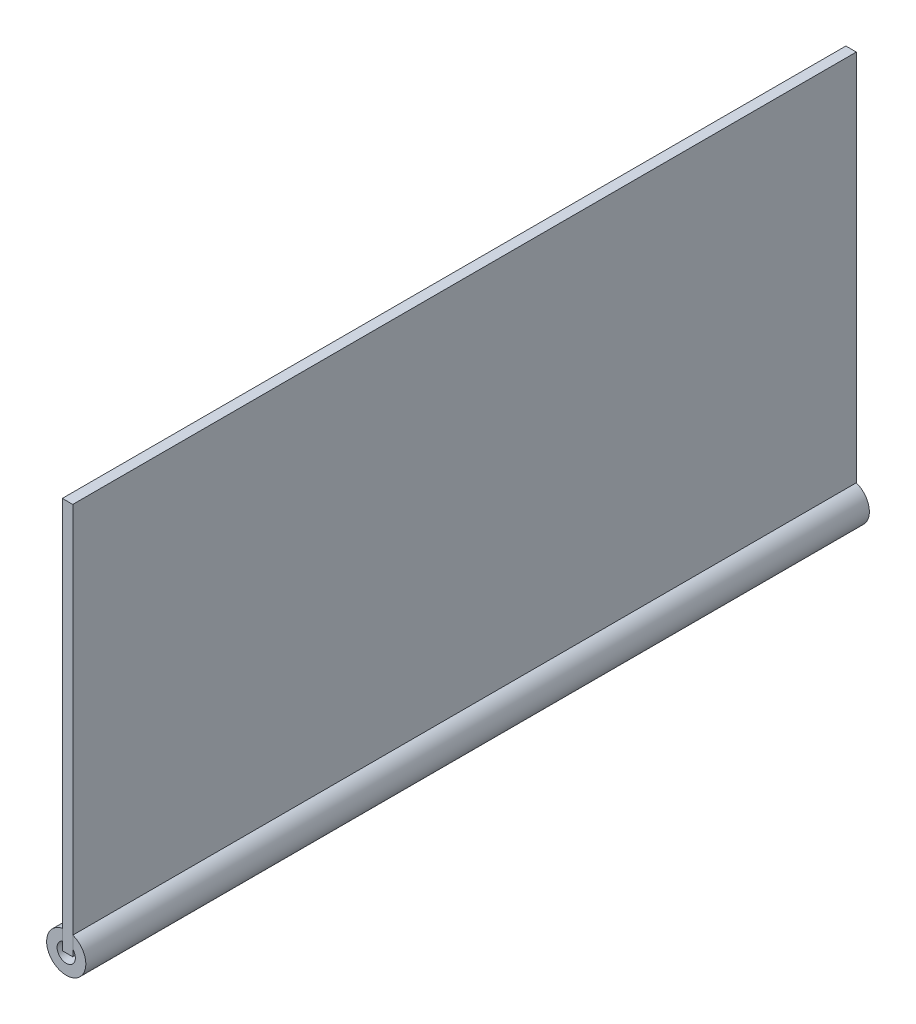
ISO-10303-21;
HEADER;
FILE_DESCRIPTION(('STEP AP214'),'2;1');
FILE_NAME('part.step','',(''),(''),'','','');
FILE_SCHEMA(('AUTOMOTIVE_DESIGN { 1 0 10303 214 1 1 1 1 }'));
ENDSEC;
DATA;
#1=APPLICATION_CONTEXT('core data for automotive mechanical design processes');
#2=APPLICATION_PROTOCOL_DEFINITION('international standard','automotive_design',2000,#1);
#3=PRODUCT_CONTEXT('',#1,'mechanical');
#4=PRODUCT('Part','Part','',(#3));
#5=PRODUCT_RELATED_PRODUCT_CATEGORY('part','',(#4));
#6=PRODUCT_DEFINITION_FORMATION('','',#4);
#7=PRODUCT_DEFINITION_CONTEXT('part definition',#1,'design');
#8=PRODUCT_DEFINITION('design','',#6,#7);
#9=PRODUCT_DEFINITION_SHAPE('','',#8);
#10=(LENGTH_UNIT() NAMED_UNIT(*) SI_UNIT(.MILLI.,.METRE.));
#11=(NAMED_UNIT(*) PLANE_ANGLE_UNIT() SI_UNIT($,.RADIAN.));
#12=(NAMED_UNIT(*) SI_UNIT($,.STERADIAN.) SOLID_ANGLE_UNIT());
#13=UNCERTAINTY_MEASURE_WITH_UNIT(LENGTH_MEASURE(1.E-05),#10,'distance_accuracy_value','');
#14=(GEOMETRIC_REPRESENTATION_CONTEXT(3) GLOBAL_UNCERTAINTY_ASSIGNED_CONTEXT((#13)) GLOBAL_UNIT_ASSIGNED_CONTEXT((#10,
#11,#12)) REPRESENTATION_CONTEXT('',''));
#15=CARTESIAN_POINT('',(0.,0.,0.));
#16=DIRECTION('',(0.,0.,1.));
#17=DIRECTION('',(1.,0.,0.));
#18=AXIS2_PLACEMENT_3D('',#15,#16,#17);
#19=CARTESIAN_POINT('',(4.,75.,-150.));
#20=DIRECTION('',(0.,0.,1.));
#21=DIRECTION('',(1.,0.,0.));
#22=AXIS2_PLACEMENT_3D('',#19,#20,#21);
#23=PLANE('',#22);
#24=DIRECTION('',(0.,1.,0.));
#25=VECTOR('',#24,1.);
#26=CARTESIAN_POINT('',(0.,75.,-150.));
#27=LINE('',#26,#25);
#28=CARTESIAN_POINT('',(0.,-75.,-150.));
#29=VERTEX_POINT('',#28);
#30=CARTESIAN_POINT('',(0.,75.,-150.));
#31=VERTEX_POINT('',#30);
#32=EDGE_CURVE('E110',#29,#31,#27,.T.);
#33=ORIENTED_EDGE('',*,*,#32,.T.);
#34=DIRECTION('',(-1.,0.,0.));
#35=VECTOR('',#34,1.);
#36=CARTESIAN_POINT('',(4.,75.,-150.));
#37=LINE('',#36,#35);
#38=CARTESIAN_POINT('',(4.,75.,-150.));
#39=VERTEX_POINT('',#38);
#40=EDGE_CURVE('E12',#39,#31,#37,.T.);
#41=ORIENTED_EDGE('',*,*,#40,.F.);
#42=DIRECTION('',(0.,1.,0.));
#43=VECTOR('',#42,1.);
#44=CARTESIAN_POINT('',(4.,75.,-150.));
#45=LINE('',#44,#43);
#46=CARTESIAN_POINT('',(4.,-75.,-150.));
#47=VERTEX_POINT('',#46);
#48=EDGE_CURVE('E98',#47,#39,#45,.T.);
#49=ORIENTED_EDGE('',*,*,#48,.F.);
#50=DIRECTION('',(-1.,0.,0.));
#51=VECTOR('',#50,1.);
#52=CARTESIAN_POINT('',(4.,-75.,-150.));
#53=LINE('',#52,#51);
#54=EDGE_CURVE('E106',#47,#29,#53,.T.);
#55=ORIENTED_EDGE('',*,*,#54,.T.);
#56=EDGE_LOOP('',(#33,#41,#49,#55));
#57=FACE_BOUND('',#56,.T.);
#58=ADVANCED_FACE('F47',(#57),#23,.F.);
#59=CARTESIAN_POINT('',(4.,75.,150.));
#60=DIRECTION('',(0.,-1.,0.));
#61=DIRECTION('',(0.,0.,-1.));
#62=AXIS2_PLACEMENT_3D('',#59,#60,#61);
#63=PLANE('',#62);
#64=DIRECTION('',(0.,0.,1.));
#65=VECTOR('',#64,1.);
#66=CARTESIAN_POINT('',(0.,75.,150.));
#67=LINE('',#66,#65);
#68=CARTESIAN_POINT('',(0.,75.,150.));
#69=VERTEX_POINT('',#68);
#70=EDGE_CURVE('E102',#31,#69,#67,.T.);
#71=ORIENTED_EDGE('',*,*,#70,.T.);
#72=DIRECTION('',(-1.,0.,0.));
#73=VECTOR('',#72,1.);
#74=CARTESIAN_POINT('',(4.,75.,150.));
#75=LINE('',#74,#73);
#76=CARTESIAN_POINT('',(4.,75.,150.));
#77=VERTEX_POINT('',#76);
#78=EDGE_CURVE('E55',#77,#69,#75,.T.);
#79=ORIENTED_EDGE('',*,*,#78,.F.);
#80=DIRECTION('',(0.,0.,1.));
#81=VECTOR('',#80,1.);
#82=CARTESIAN_POINT('',(4.,75.,150.));
#83=LINE('',#82,#81);
#84=EDGE_CURVE('E93',#39,#77,#83,.T.);
#85=ORIENTED_EDGE('',*,*,#84,.F.);
#86=ORIENTED_EDGE('',*,*,#40,.T.);
#87=EDGE_LOOP('',(#71,#79,#85,#86));
#88=FACE_BOUND('',#87,.T.);
#89=ADVANCED_FACE('F101',(#88),#63,.F.);
#90=CARTESIAN_POINT('',(4.,75.,150.));
#91=DIRECTION('',(0.,0.,-1.));
#92=DIRECTION('',(0.,1.,0.));
#93=AXIS2_PLACEMENT_3D('',#90,#91,#92);
#94=PLANE('',#93);
#95=DIRECTION('',(0.,-1.,0.));
#96=VECTOR('',#95,1.);
#97=CARTESIAN_POINT('',(0.,75.,150.));
#98=LINE('',#97,#96);
#99=CARTESIAN_POINT('',(0.,-75.,150.));
#100=VERTEX_POINT('',#99);
#101=EDGE_CURVE('E80',#69,#100,#98,.T.);
#102=ORIENTED_EDGE('',*,*,#101,.T.);
#103=DIRECTION('',(-1.,0.,0.));
#104=VECTOR('',#103,1.);
#105=CARTESIAN_POINT('',(4.,-75.,150.));
#106=LINE('',#105,#104);
#107=CARTESIAN_POINT('',(4.,-75.,150.));
#108=VERTEX_POINT('',#107);
#109=EDGE_CURVE('E103',#108,#100,#106,.T.);
#110=ORIENTED_EDGE('',*,*,#109,.F.);
#111=DIRECTION('',(0.,-1.,0.));
#112=VECTOR('',#111,1.);
#113=CARTESIAN_POINT('',(4.,75.,150.));
#114=LINE('',#113,#112);
#115=EDGE_CURVE('E96',#77,#108,#114,.T.);
#116=ORIENTED_EDGE('',*,*,#115,.F.);
#117=ORIENTED_EDGE('',*,*,#78,.T.);
#118=EDGE_LOOP('',(#102,#110,#116,#117));
#119=FACE_BOUND('',#118,.T.);
#120=ADVANCED_FACE('F104',(#119),#94,.F.);
#121=CARTESIAN_POINT('',(4.,-75.,150.));
#122=DIRECTION('',(0.,1.,0.));
#123=DIRECTION('',(0.,0.,1.));
#124=AXIS2_PLACEMENT_3D('',#121,#122,#123);
#125=PLANE('',#124);
#126=DIRECTION('',(0.,0.,-1.));
#127=VECTOR('',#126,1.);
#128=CARTESIAN_POINT('',(0.,-75.,150.));
#129=LINE('',#128,#127);
#130=EDGE_CURVE('E86',#100,#29,#129,.T.);
#131=ORIENTED_EDGE('',*,*,#130,.T.);
#132=ORIENTED_EDGE('',*,*,#54,.F.);
#133=DIRECTION('',(0.,0.,-1.));
#134=VECTOR('',#133,1.);
#135=CARTESIAN_POINT('',(4.,-75.,150.));
#136=LINE('',#135,#134);
#137=EDGE_CURVE('E63',#108,#47,#136,.T.);
#138=ORIENTED_EDGE('',*,*,#137,.F.);
#139=ORIENTED_EDGE('',*,*,#109,.T.);
#140=EDGE_LOOP('',(#131,#132,#138,#139));
#141=FACE_BOUND('',#140,.T.);
#142=ADVANCED_FACE('F117',(#141),#125,.F.);
#143=CARTESIAN_POINT('',(4.,0.,0.));
#144=DIRECTION('',(1.,0.,0.));
#145=DIRECTION('',(0.,0.,-1.));
#146=AXIS2_PLACEMENT_3D('',#143,#144,#145);
#147=PLANE('',#146);
#148=ORIENTED_EDGE('',*,*,#48,.T.);
#149=ORIENTED_EDGE('',*,*,#84,.T.);
#150=ORIENTED_EDGE('',*,*,#115,.T.);
#151=ORIENTED_EDGE('',*,*,#137,.T.);
#152=EDGE_LOOP('',(#148,#149,#150,#151));
#153=FACE_BOUND('',#152,.T.);
#154=ADVANCED_FACE('F94',(#153),#147,.T.);
#155=CARTESIAN_POINT('',(0.,0.,0.));
#156=DIRECTION('',(1.,0.,0.));
#157=DIRECTION('',(0.,0.,-1.));
#158=AXIS2_PLACEMENT_3D('',#155,#156,#157);
#159=PLANE('',#158);
#160=ORIENTED_EDGE('',*,*,#32,.F.);
#161=ORIENTED_EDGE('',*,*,#130,.F.);
#162=ORIENTED_EDGE('',*,*,#101,.F.);
#163=ORIENTED_EDGE('',*,*,#70,.F.);
#164=EDGE_LOOP('',(#160,#161,#162,#163));
#165=FACE_BOUND('',#164,.T.);
#166=ADVANCED_FACE('F120',(#165),#159,.F.);
#167=CLOSED_SHELL('',(#58,#89,#120,#142,#154,#166));
#168=MANIFOLD_SOLID_BREP('B2',#167);
#169=CARTESIAN_POINT('',(3.,-74.9,-150.));
#170=DIRECTION('',(0.,0.,1.));
#171=DIRECTION('',(1.,0.,0.));
#172=AXIS2_PLACEMENT_3D('',#169,#170,#171);
#173=PLANE('',#172);
#174=CARTESIAN_POINT('',(1.5,-74.9,-150.));
#175=DIRECTION('',(0.,0.,1.));
#176=DIRECTION('',(1.,0.,0.));
#177=AXIS2_PLACEMENT_3D('',#174,#175,#176);
#178=CIRCLE('',#177,3.5);
#179=CARTESIAN_POINT('',(5.,-74.9,-150.));
#180=VERTEX_POINT('',#179);
#181=EDGE_CURVE('E228',#180,#180,#178,.T.);
#182=ORIENTED_EDGE('',*,*,#181,.T.);
#183=EDGE_LOOP('',(#182));
#184=FACE_BOUND('',#183,.T.);
#185=DIRECTION('',(0.,1.,0.));
#186=VECTOR('',#185,1.);
#187=CARTESIAN_POINT('',(3.,-74.9,-150.));
#188=LINE('',#187,#186);
#189=CARTESIAN_POINT('',(3.,-67.5515307716505,-150.));
#190=VERTEX_POINT('',#189);
#191=CARTESIAN_POINT('',(3.,74.9,-150.));
#192=VERTEX_POINT('',#191);
#193=EDGE_CURVE('E234',#190,#192,#188,.T.);
#194=ORIENTED_EDGE('',*,*,#193,.F.);
#195=CARTESIAN_POINT('',(1.5,-74.9,-150.));
#196=DIRECTION('',(0.,0.,1.));
#197=DIRECTION('',(1.,0.,0.));
#198=AXIS2_PLACEMENT_3D('',#195,#196,#197);
#199=CIRCLE('',#198,7.5);
#200=CARTESIAN_POINT('',(0.,-67.5515307716505,-150.));
#201=VERTEX_POINT('',#200);
#202=EDGE_CURVE('E217',#201,#190,#199,.T.);
#203=ORIENTED_EDGE('',*,*,#202,.F.);
#204=DIRECTION('',(0.,1.,0.));
#205=VECTOR('',#204,1.);
#206=CARTESIAN_POINT('',(0.,-74.9,-150.));
#207=LINE('',#206,#205);
#208=CARTESIAN_POINT('',(0.,74.9,-150.));
#209=VERTEX_POINT('',#208);
#210=EDGE_CURVE('E198',#201,#209,#207,.T.);
#211=ORIENTED_EDGE('',*,*,#210,.T.);
#212=DIRECTION('',(-1.,0.,0.));
#213=VECTOR('',#212,1.);
#214=CARTESIAN_POINT('',(3.,74.9,-150.));
#215=LINE('',#214,#213);
#216=EDGE_CURVE('E179',#192,#209,#215,.T.);
#217=ORIENTED_EDGE('',*,*,#216,.F.);
#218=EDGE_LOOP('',(#194,#203,#211,#217));
#219=FACE_BOUND('',#218,.T.);
#220=ADVANCED_FACE('F171',(#184,#219),#173,.F.);
#221=CARTESIAN_POINT('',(3.,74.9,150.));
#222=DIRECTION('',(0.,-1.,0.));
#223=DIRECTION('',(0.,0.,-1.));
#224=AXIS2_PLACEMENT_3D('',#221,#222,#223);
#225=PLANE('',#224);
#226=DIRECTION('',(0.,0.,1.));
#227=VECTOR('',#226,1.);
#228=CARTESIAN_POINT('',(0.,74.9,150.));
#229=LINE('',#228,#227);
#230=CARTESIAN_POINT('',(0.,74.9,150.));
#231=VERTEX_POINT('',#230);
#232=EDGE_CURVE('E239',#209,#231,#229,.T.);
#233=ORIENTED_EDGE('',*,*,#232,.T.);
#234=DIRECTION('',(-1.,0.,0.));
#235=VECTOR('',#234,1.);
#236=CARTESIAN_POINT('',(3.,74.9,150.));
#237=LINE('',#236,#235);
#238=CARTESIAN_POINT('',(3.,74.9,150.));
#239=VERTEX_POINT('',#238);
#240=EDGE_CURVE('E231',#239,#231,#237,.T.);
#241=ORIENTED_EDGE('',*,*,#240,.F.);
#242=DIRECTION('',(0.,0.,1.));
#243=VECTOR('',#242,1.);
#244=CARTESIAN_POINT('',(3.,74.9,150.));
#245=LINE('',#244,#243);
#246=EDGE_CURVE('E187',#192,#239,#245,.T.);
#247=ORIENTED_EDGE('',*,*,#246,.F.);
#248=ORIENTED_EDGE('',*,*,#216,.T.);
#249=EDGE_LOOP('',(#233,#241,#247,#248));
#250=FACE_BOUND('',#249,.T.);
#251=ADVANCED_FACE('F243',(#250),#225,.F.);
#252=CARTESIAN_POINT('',(3.,-74.9,150.));
#253=DIRECTION('',(0.,0.,-1.));
#254=DIRECTION('',(-1.,0.,0.));
#255=AXIS2_PLACEMENT_3D('',#252,#253,#254);
#256=PLANE('',#255);
#257=CARTESIAN_POINT('',(1.5,-74.9,150.));
#258=DIRECTION('',(0.,0.,1.));
#259=DIRECTION('',(1.,0.,0.));
#260=AXIS2_PLACEMENT_3D('',#257,#258,#259);
#261=CIRCLE('',#260,3.5);
#262=CARTESIAN_POINT('',(5.,-74.9,150.));
#263=VERTEX_POINT('',#262);
#264=EDGE_CURVE('E246',#263,#263,#261,.T.);
#265=ORIENTED_EDGE('',*,*,#264,.F.);
#266=EDGE_LOOP('',(#265));
#267=FACE_BOUND('',#266,.T.);
#268=DIRECTION('',(0.,-1.,0.));
#269=VECTOR('',#268,1.);
#270=CARTESIAN_POINT('',(0.,-74.9,150.));
#271=LINE('',#270,#269);
#272=CARTESIAN_POINT('',(0.,-67.5515307716505,150.));
#273=VERTEX_POINT('',#272);
#274=EDGE_CURVE('E227',#231,#273,#271,.T.);
#275=ORIENTED_EDGE('',*,*,#274,.T.);
#276=CARTESIAN_POINT('',(1.5,-74.9,150.));
#277=DIRECTION('',(0.,0.,1.));
#278=DIRECTION('',(1.,0.,0.));
#279=AXIS2_PLACEMENT_3D('',#276,#277,#278);
#280=CIRCLE('',#279,7.5);
#281=CARTESIAN_POINT('',(3.,-67.5515307716505,150.));
#282=VERTEX_POINT('',#281);
#283=EDGE_CURVE('E216',#273,#282,#280,.T.);
#284=ORIENTED_EDGE('',*,*,#283,.T.);
#285=DIRECTION('',(0.,-1.,0.));
#286=VECTOR('',#285,1.);
#287=CARTESIAN_POINT('',(3.,-74.9,150.));
#288=LINE('',#287,#286);
#289=EDGE_CURVE('E225',#239,#282,#288,.T.);
#290=ORIENTED_EDGE('',*,*,#289,.F.);
#291=ORIENTED_EDGE('',*,*,#240,.T.);
#292=EDGE_LOOP('',(#275,#284,#290,#291));
#293=FACE_BOUND('',#292,.T.);
#294=ADVANCED_FACE('F223',(#267,#293),#256,.F.);
#295=CARTESIAN_POINT('',(3.,0.,0.));
#296=DIRECTION('',(-1.,0.,0.));
#297=DIRECTION('',(0.,0.,1.));
#298=AXIS2_PLACEMENT_3D('',#295,#296,#297);
#299=PLANE('',#298);
#300=ORIENTED_EDGE('',*,*,#289,.T.);
#301=DIRECTION('',(0.,0.,1.));
#302=VECTOR('',#301,1.);
#303=CARTESIAN_POINT('',(3.,-67.5515307716505,-150.));
#304=LINE('',#303,#302);
#305=EDGE_CURVE('E213',#282,#190,#304,.F.);
#306=ORIENTED_EDGE('',*,*,#305,.T.);
#307=ORIENTED_EDGE('',*,*,#193,.T.);
#308=ORIENTED_EDGE('',*,*,#246,.T.);
#309=EDGE_LOOP('',(#300,#306,#307,#308));
#310=FACE_BOUND('',#309,.T.);
#311=ADVANCED_FACE('F230',(#310),#299,.F.);
#312=CARTESIAN_POINT('',(0.,0.,0.));
#313=DIRECTION('',(-1.,0.,0.));
#314=DIRECTION('',(0.,0.,1.));
#315=AXIS2_PLACEMENT_3D('',#312,#313,#314);
#316=PLANE('',#315);
#317=DIRECTION('',(0.,0.,1.));
#318=VECTOR('',#317,1.);
#319=CARTESIAN_POINT('',(0.,-67.5515307716505,-150.));
#320=LINE('',#319,#318);
#321=EDGE_CURVE('E45',#273,#201,#320,.F.);
#322=ORIENTED_EDGE('',*,*,#321,.F.);
#323=ORIENTED_EDGE('',*,*,#274,.F.);
#324=ORIENTED_EDGE('',*,*,#232,.F.);
#325=ORIENTED_EDGE('',*,*,#210,.F.);
#326=EDGE_LOOP('',(#322,#323,#324,#325));
#327=FACE_BOUND('',#326,.T.);
#328=ADVANCED_FACE('F265',(#327),#316,.T.);
#329=CARTESIAN_POINT('',(1.5,-74.9,-150.));
#330=DIRECTION('',(0.,0.,1.));
#331=DIRECTION('',(1.,0.,0.));
#332=AXIS2_PLACEMENT_3D('',#329,#330,#331);
#333=CYLINDRICAL_SURFACE('',#332,7.5);
#334=ORIENTED_EDGE('',*,*,#305,.F.);
#335=ORIENTED_EDGE('',*,*,#283,.F.);
#336=ORIENTED_EDGE('',*,*,#321,.T.);
#337=ORIENTED_EDGE('',*,*,#202,.T.);
#338=EDGE_LOOP('',(#334,#335,#336,#337));
#339=FACE_BOUND('',#338,.T.);
#340=ADVANCED_FACE('F215',(#339),#333,.T.);
#341=CARTESIAN_POINT('',(1.5,-74.9,-150.));
#342=DIRECTION('',(0.,0.,1.));
#343=DIRECTION('',(1.,0.,0.));
#344=AXIS2_PLACEMENT_3D('',#341,#342,#343);
#345=CYLINDRICAL_SURFACE('',#344,3.5);
#346=ORIENTED_EDGE('',*,*,#181,.F.);
#347=EDGE_LOOP('',(#346));
#348=FACE_BOUND('',#347,.T.);
#349=ORIENTED_EDGE('',*,*,#264,.T.);
#350=EDGE_LOOP('',(#349));
#351=FACE_BOUND('',#350,.T.);
#352=ADVANCED_FACE('F253',(#348,#351),#345,.F.);
#353=CLOSED_SHELL('',(#220,#251,#294,#311,#328,#340,#352));
#354=MANIFOLD_SOLID_BREP('B6',#353);
#355=ADVANCED_BREP_SHAPE_REPRESENTATION('',(#18,#168,#354),#14);
#356=SHAPE_DEFINITION_REPRESENTATION(#9,#355);
ENDSEC;
END-ISO-10303-21;
